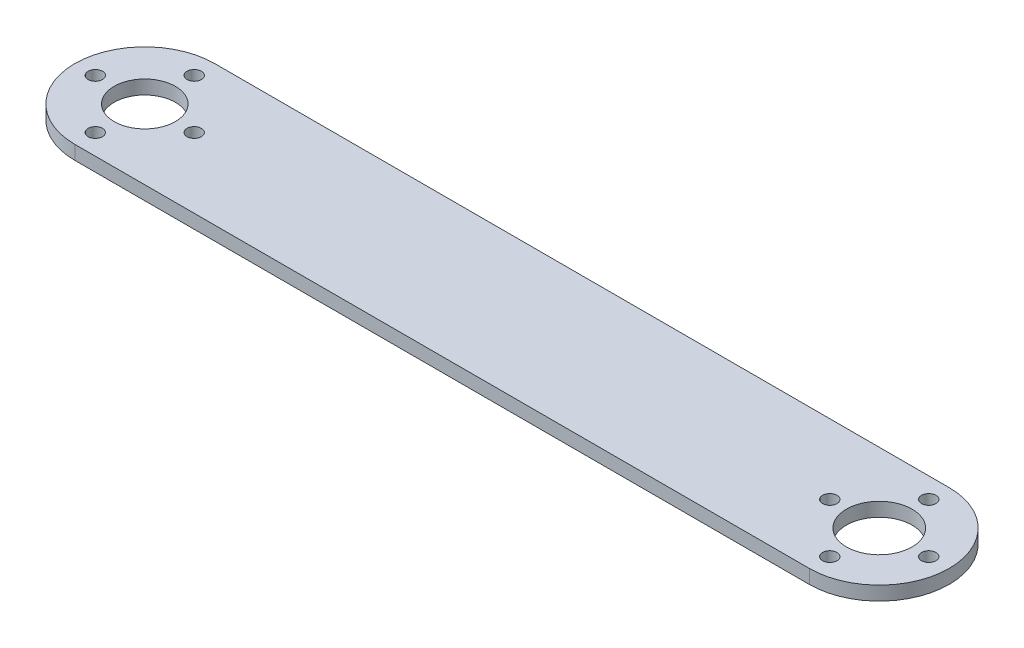
ISO-10303-21;
HEADER;
FILE_DESCRIPTION(('STEP AP214'),'2;1');
FILE_NAME('part.step','',(''),(''),'','','');
FILE_SCHEMA(('AUTOMOTIVE_DESIGN { 1 0 10303 214 1 1 1 1 }'));
ENDSEC;
DATA;
#1=APPLICATION_CONTEXT('core data for automotive mechanical design processes');
#2=APPLICATION_PROTOCOL_DEFINITION('international standard','automotive_design',2000,#1);
#3=PRODUCT_CONTEXT('',#1,'mechanical');
#4=PRODUCT('Part','Part','',(#3));
#5=PRODUCT_RELATED_PRODUCT_CATEGORY('part','',(#4));
#6=PRODUCT_DEFINITION_FORMATION('','',#4);
#7=PRODUCT_DEFINITION_CONTEXT('part definition',#1,'design');
#8=PRODUCT_DEFINITION('design','',#6,#7);
#9=PRODUCT_DEFINITION_SHAPE('','',#8);
#10=(LENGTH_UNIT() NAMED_UNIT(*) SI_UNIT(.MILLI.,.METRE.));
#11=(NAMED_UNIT(*) PLANE_ANGLE_UNIT() SI_UNIT($,.RADIAN.));
#12=(NAMED_UNIT(*) SI_UNIT($,.STERADIAN.) SOLID_ANGLE_UNIT());
#13=UNCERTAINTY_MEASURE_WITH_UNIT(LENGTH_MEASURE(1.E-05),#10,'distance_accuracy_value','');
#14=(GEOMETRIC_REPRESENTATION_CONTEXT(3) GLOBAL_UNCERTAINTY_ASSIGNED_CONTEXT((#13)) GLOBAL_UNIT_ASSIGNED_CONTEXT((#10,
#11,#12)) REPRESENTATION_CONTEXT('',''));
#15=CARTESIAN_POINT('',(0.,0.,0.));
#16=DIRECTION('',(0.,0.,1.));
#17=DIRECTION('',(1.,0.,0.));
#18=AXIS2_PLACEMENT_3D('',#15,#16,#17);
#19=CARTESIAN_POINT('',(0.,3.175,0.));
#20=DIRECTION('',(0.,1.,0.));
#21=DIRECTION('',(0.,0.,1.));
#22=AXIS2_PLACEMENT_3D('',#19,#20,#21);
#23=PLANE('',#22);
#24=CARTESIAN_POINT('',(168.,3.175,-27.3137084989848));
#25=DIRECTION('',(0.,1.,0.));
#26=DIRECTION('',(0.,0.,1.));
#27=AXIS2_PLACEMENT_3D('',#24,#25,#26);
#28=CIRCLE('',#27,1.65000000000002);
#29=CARTESIAN_POINT('',(168.,3.175,-25.6637084989848));
#30=VERTEX_POINT('',#29);
#31=EDGE_CURVE('E218',#30,#30,#28,.F.);
#32=ORIENTED_EDGE('',*,*,#31,.T.);
#33=EDGE_LOOP('',(#32));
#34=FACE_BOUND('',#33,.T.);
#35=CARTESIAN_POINT('',(168.,3.175,-4.68629150101526));
#36=DIRECTION('',(0.,-1.,0.));
#37=DIRECTION('',(0.,0.,-1.));
#38=AXIS2_PLACEMENT_3D('',#35,#36,#37);
#39=CIRCLE('',#38,1.65000000000002);
#40=CARTESIAN_POINT('',(168.,3.175,-6.33629150101528));
#41=VERTEX_POINT('',#40);
#42=EDGE_CURVE('E265',#41,#41,#39,.T.);
#43=ORIENTED_EDGE('',*,*,#42,.T.);
#44=EDGE_LOOP('',(#43));
#45=FACE_BOUND('',#44,.T.);
#46=CARTESIAN_POINT('',(179.313708498985,3.175,-16.));
#47=DIRECTION('',(0.,-1.,0.));
#48=DIRECTION('',(0.,0.,-1.));
#49=AXIS2_PLACEMENT_3D('',#46,#47,#48);
#50=CIRCLE('',#49,1.64999999999999);
#51=CARTESIAN_POINT('',(179.313708498985,3.175,-17.65));
#52=VERTEX_POINT('',#51);
#53=EDGE_CURVE('E268',#52,#52,#50,.T.);
#54=ORIENTED_EDGE('',*,*,#53,.T.);
#55=EDGE_LOOP('',(#54));
#56=FACE_BOUND('',#55,.T.);
#57=CARTESIAN_POINT('',(156.686291501015,3.175,-16.));
#58=DIRECTION('',(0.,1.,0.));
#59=DIRECTION('',(0.,0.,1.));
#60=AXIS2_PLACEMENT_3D('',#57,#58,#59);
#61=CIRCLE('',#60,1.64999999999999);
#62=CARTESIAN_POINT('',(156.686291501015,3.175,-14.35));
#63=VERTEX_POINT('',#62);
#64=EDGE_CURVE('E127',#63,#63,#61,.F.);
#65=ORIENTED_EDGE('',*,*,#64,.T.);
#66=EDGE_LOOP('',(#65));
#67=FACE_BOUND('',#66,.T.);
#68=CARTESIAN_POINT('',(168.,3.175,-16.));
#69=DIRECTION('',(0.,1.,0.));
#70=DIRECTION('',(0.,0.,1.));
#71=AXIS2_PLACEMENT_3D('',#68,#69,#70);
#72=CIRCLE('',#71,16.);
#73=CARTESIAN_POINT('',(168.,3.175,-32.));
#74=VERTEX_POINT('',#73);
#75=CARTESIAN_POINT('',(168.,3.175,0.));
#76=VERTEX_POINT('',#75);
#77=EDGE_CURVE('E96',#74,#76,#72,.F.);
#78=ORIENTED_EDGE('',*,*,#77,.F.);
#79=DIRECTION('',(1.,0.,0.));
#80=VECTOR('',#79,1.);
#81=CARTESIAN_POINT('',(0.,3.175,-32.));
#82=LINE('',#81,#80);
#83=CARTESIAN_POINT('',(0.,3.175,-32.));
#84=VERTEX_POINT('',#83);
#85=EDGE_CURVE('E87',#84,#74,#82,.T.);
#86=ORIENTED_EDGE('',*,*,#85,.F.);
#87=CARTESIAN_POINT('',(0.,3.175,-16.));
#88=DIRECTION('',(0.,1.,0.));
#89=DIRECTION('',(0.,0.,1.));
#90=AXIS2_PLACEMENT_3D('',#87,#88,#89);
#91=CIRCLE('',#90,16.);
#92=CARTESIAN_POINT('',(0.,3.175,0.));
#93=VERTEX_POINT('',#92);
#94=EDGE_CURVE('E92',#84,#93,#91,.T.);
#95=ORIENTED_EDGE('',*,*,#94,.T.);
#96=DIRECTION('',(1.,0.,0.));
#97=VECTOR('',#96,1.);
#98=CARTESIAN_POINT('',(0.,3.175,0.));
#99=LINE('',#98,#97);
#100=EDGE_CURVE('E54',#93,#76,#99,.T.);
#101=ORIENTED_EDGE('',*,*,#100,.T.);
#102=EDGE_LOOP('',(#78,#86,#95,#101));
#103=FACE_BOUND('',#102,.T.);
#104=CARTESIAN_POINT('',(168.,3.175,-16.));
#105=DIRECTION('',(0.,1.,0.));
#106=DIRECTION('',(0.,0.,1.));
#107=AXIS2_PLACEMENT_3D('',#104,#105,#106);
#108=CIRCLE('',#107,7.50000000000001);
#109=CARTESIAN_POINT('',(168.,3.175,-8.49999999999999));
#110=VERTEX_POINT('',#109);
#111=EDGE_CURVE('E103',#110,#110,#108,.T.);
#112=ORIENTED_EDGE('',*,*,#111,.F.);
#113=EDGE_LOOP('',(#112));
#114=FACE_BOUND('',#113,.T.);
#115=CARTESIAN_POINT('',(0.,3.175,-16.));
#116=DIRECTION('',(0.,1.,0.));
#117=DIRECTION('',(0.,0.,1.));
#118=AXIS2_PLACEMENT_3D('',#115,#116,#117);
#119=CIRCLE('',#118,7.);
#120=CARTESIAN_POINT('',(0.,3.175,-9.));
#121=VERTEX_POINT('',#120);
#122=EDGE_CURVE('E106',#121,#121,#119,.T.);
#123=ORIENTED_EDGE('',*,*,#122,.F.);
#124=EDGE_LOOP('',(#123));
#125=FACE_BOUND('',#124,.T.);
#126=CARTESIAN_POINT('',(0.,3.175,-4.68629150101524));
#127=DIRECTION('',(0.,1.,0.));
#128=DIRECTION('',(0.,0.,1.));
#129=AXIS2_PLACEMENT_3D('',#126,#127,#128);
#130=CIRCLE('',#129,1.65);
#131=CARTESIAN_POINT('',(0.,3.175,-3.03629150101524));
#132=VERTEX_POINT('',#131);
#133=EDGE_CURVE('E256',#132,#132,#130,.T.);
#134=ORIENTED_EDGE('',*,*,#133,.F.);
#135=EDGE_LOOP('',(#134));
#136=FACE_BOUND('',#135,.T.);
#137=CARTESIAN_POINT('',(-11.3137084989848,3.175,-16.));
#138=DIRECTION('',(0.,1.,0.));
#139=DIRECTION('',(0.,0.,1.));
#140=AXIS2_PLACEMENT_3D('',#137,#138,#139);
#141=CIRCLE('',#140,1.65);
#142=CARTESIAN_POINT('',(-11.3137084989848,3.175,-14.35));
#143=VERTEX_POINT('',#142);
#144=EDGE_CURVE('E216',#143,#143,#141,.T.);
#145=ORIENTED_EDGE('',*,*,#144,.F.);
#146=EDGE_LOOP('',(#145));
#147=FACE_BOUND('',#146,.T.);
#148=CARTESIAN_POINT('',(0.,3.175,-27.3137084989848));
#149=DIRECTION('',(0.,1.,0.));
#150=DIRECTION('',(0.,0.,1.));
#151=AXIS2_PLACEMENT_3D('',#148,#149,#150);
#152=CIRCLE('',#151,1.65);
#153=CARTESIAN_POINT('',(0.,3.175,-25.6637084989848));
#154=VERTEX_POINT('',#153);
#155=EDGE_CURVE('E219',#154,#154,#152,.T.);
#156=ORIENTED_EDGE('',*,*,#155,.F.);
#157=EDGE_LOOP('',(#156));
#158=FACE_BOUND('',#157,.T.);
#159=CARTESIAN_POINT('',(11.3137084989848,3.175,-16.));
#160=DIRECTION('',(0.,1.,0.));
#161=DIRECTION('',(0.,0.,1.));
#162=AXIS2_PLACEMENT_3D('',#159,#160,#161);
#163=CIRCLE('',#162,1.65);
#164=CARTESIAN_POINT('',(11.3137084989848,3.175,-14.35));
#165=VERTEX_POINT('',#164);
#166=EDGE_CURVE('E223',#165,#165,#163,.T.);
#167=ORIENTED_EDGE('',*,*,#166,.F.);
#168=EDGE_LOOP('',(#167));
#169=FACE_BOUND('',#168,.T.);
#170=ADVANCED_FACE('F35',(#34,#45,#56,#67,#103,#114,#125,#136,#147,#158,#169),#23,.T.);
#171=CARTESIAN_POINT('',(0.,0.,0.));
#172=DIRECTION('',(0.,1.,0.));
#173=DIRECTION('',(0.,0.,1.));
#174=AXIS2_PLACEMENT_3D('',#171,#172,#173);
#175=PLANE('',#174);
#176=CARTESIAN_POINT('',(0.,0.,-27.3137084989848));
#177=DIRECTION('',(0.,1.,0.));
#178=DIRECTION('',(0.,0.,1.));
#179=AXIS2_PLACEMENT_3D('',#176,#177,#178);
#180=CIRCLE('',#179,1.65);
#181=CARTESIAN_POINT('',(0.,0.,-25.6637084989848));
#182=VERTEX_POINT('',#181);
#183=EDGE_CURVE('E141',#182,#182,#180,.T.);
#184=ORIENTED_EDGE('',*,*,#183,.T.);
#185=EDGE_LOOP('',(#184));
#186=FACE_BOUND('',#185,.T.);
#187=CARTESIAN_POINT('',(0.,0.,-4.68629150101524));
#188=DIRECTION('',(0.,1.,0.));
#189=DIRECTION('',(0.,0.,1.));
#190=AXIS2_PLACEMENT_3D('',#187,#188,#189);
#191=CIRCLE('',#190,1.65);
#192=CARTESIAN_POINT('',(0.,0.,-3.03629150101524));
#193=VERTEX_POINT('',#192);
#194=EDGE_CURVE('E133',#193,#193,#191,.T.);
#195=ORIENTED_EDGE('',*,*,#194,.T.);
#196=EDGE_LOOP('',(#195));
#197=FACE_BOUND('',#196,.T.);
#198=CARTESIAN_POINT('',(168.,0.,-4.68629150101526));
#199=DIRECTION('',(0.,1.,0.));
#200=DIRECTION('',(0.,0.,1.));
#201=AXIS2_PLACEMENT_3D('',#198,#199,#200);
#202=CIRCLE('',#201,1.65000000000002);
#203=CARTESIAN_POINT('',(168.,0.,-3.03629150101524));
#204=VERTEX_POINT('',#203);
#205=EDGE_CURVE('E130',#204,#204,#202,.F.);
#206=ORIENTED_EDGE('',*,*,#205,.F.);
#207=EDGE_LOOP('',(#206));
#208=FACE_BOUND('',#207,.T.);
#209=CARTESIAN_POINT('',(179.313708498985,0.,-16.));
#210=DIRECTION('',(0.,1.,0.));
#211=DIRECTION('',(0.,0.,1.));
#212=AXIS2_PLACEMENT_3D('',#209,#210,#211);
#213=CIRCLE('',#212,1.64999999999999);
#214=CARTESIAN_POINT('',(179.313708498985,0.,-14.35));
#215=VERTEX_POINT('',#214);
#216=EDGE_CURVE('E126',#215,#215,#213,.F.);
#217=ORIENTED_EDGE('',*,*,#216,.F.);
#218=EDGE_LOOP('',(#217));
#219=FACE_BOUND('',#218,.T.);
#220=CARTESIAN_POINT('',(156.686291501015,0.,-16.));
#221=DIRECTION('',(0.,1.,0.));
#222=DIRECTION('',(0.,0.,1.));
#223=AXIS2_PLACEMENT_3D('',#220,#221,#222);
#224=CIRCLE('',#223,1.64999999999999);
#225=CARTESIAN_POINT('',(156.686291501015,0.,-14.35));
#226=VERTEX_POINT('',#225);
#227=EDGE_CURVE('E123',#226,#226,#224,.F.);
#228=ORIENTED_EDGE('',*,*,#227,.F.);
#229=EDGE_LOOP('',(#228));
#230=FACE_BOUND('',#229,.T.);
#231=CARTESIAN_POINT('',(168.,0.,-16.));
#232=DIRECTION('',(0.,1.,0.));
#233=DIRECTION('',(0.,0.,1.));
#234=AXIS2_PLACEMENT_3D('',#231,#232,#233);
#235=CIRCLE('',#234,16.);
#236=CARTESIAN_POINT('',(168.,0.,-32.));
#237=VERTEX_POINT('',#236);
#238=CARTESIAN_POINT('',(168.,0.,0.));
#239=VERTEX_POINT('',#238);
#240=EDGE_CURVE('E109',#237,#239,#235,.F.);
#241=ORIENTED_EDGE('',*,*,#240,.T.);
#242=DIRECTION('',(1.,0.,0.));
#243=VECTOR('',#242,1.);
#244=CARTESIAN_POINT('',(0.,0.,0.));
#245=LINE('',#244,#243);
#246=CARTESIAN_POINT('',(0.,0.,0.));
#247=VERTEX_POINT('',#246);
#248=EDGE_CURVE('E114',#247,#239,#245,.T.);
#249=ORIENTED_EDGE('',*,*,#248,.F.);
#250=CARTESIAN_POINT('',(0.,0.,-16.));
#251=DIRECTION('',(0.,1.,0.));
#252=DIRECTION('',(0.,0.,1.));
#253=AXIS2_PLACEMENT_3D('',#250,#251,#252);
#254=CIRCLE('',#253,16.);
#255=CARTESIAN_POINT('',(0.,0.,-32.));
#256=VERTEX_POINT('',#255);
#257=EDGE_CURVE('E69',#256,#247,#254,.T.);
#258=ORIENTED_EDGE('',*,*,#257,.F.);
#259=DIRECTION('',(1.,0.,0.));
#260=VECTOR('',#259,1.);
#261=CARTESIAN_POINT('',(0.,0.,-32.));
#262=LINE('',#261,#260);
#263=EDGE_CURVE('E89',#256,#237,#262,.T.);
#264=ORIENTED_EDGE('',*,*,#263,.T.);
#265=EDGE_LOOP('',(#241,#249,#258,#264));
#266=FACE_BOUND('',#265,.T.);
#267=CARTESIAN_POINT('',(168.,0.,-16.));
#268=DIRECTION('',(0.,1.,0.));
#269=DIRECTION('',(0.,0.,1.));
#270=AXIS2_PLACEMENT_3D('',#267,#268,#269);
#271=CIRCLE('',#270,7.50000000000001);
#272=CARTESIAN_POINT('',(168.,0.,-8.49999999999999));
#273=VERTEX_POINT('',#272);
#274=EDGE_CURVE('E116',#273,#273,#271,.T.);
#275=ORIENTED_EDGE('',*,*,#274,.T.);
#276=EDGE_LOOP('',(#275));
#277=FACE_BOUND('',#276,.T.);
#278=CARTESIAN_POINT('',(0.,0.,-16.));
#279=DIRECTION('',(0.,1.,0.));
#280=DIRECTION('',(0.,0.,1.));
#281=AXIS2_PLACEMENT_3D('',#278,#279,#280);
#282=CIRCLE('',#281,7.);
#283=CARTESIAN_POINT('',(0.,0.,-9.));
#284=VERTEX_POINT('',#283);
#285=EDGE_CURVE('E98',#284,#284,#282,.T.);
#286=ORIENTED_EDGE('',*,*,#285,.T.);
#287=EDGE_LOOP('',(#286));
#288=FACE_BOUND('',#287,.T.);
#289=CARTESIAN_POINT('',(168.,0.,-27.3137084989848));
#290=DIRECTION('',(0.,1.,0.));
#291=DIRECTION('',(0.,0.,1.));
#292=AXIS2_PLACEMENT_3D('',#289,#290,#291);
#293=CIRCLE('',#292,1.65000000000002);
#294=CARTESIAN_POINT('',(168.,0.,-25.6637084989848));
#295=VERTEX_POINT('',#294);
#296=EDGE_CURVE('E136',#295,#295,#293,.F.);
#297=ORIENTED_EDGE('',*,*,#296,.F.);
#298=EDGE_LOOP('',(#297));
#299=FACE_BOUND('',#298,.T.);
#300=CARTESIAN_POINT('',(-11.3137084989848,0.,-16.));
#301=DIRECTION('',(0.,1.,0.));
#302=DIRECTION('',(0.,0.,1.));
#303=AXIS2_PLACEMENT_3D('',#300,#301,#302);
#304=CIRCLE('',#303,1.65);
#305=CARTESIAN_POINT('',(-11.3137084989848,0.,-14.35));
#306=VERTEX_POINT('',#305);
#307=EDGE_CURVE('E139',#306,#306,#304,.T.);
#308=ORIENTED_EDGE('',*,*,#307,.T.);
#309=EDGE_LOOP('',(#308));
#310=FACE_BOUND('',#309,.T.);
#311=CARTESIAN_POINT('',(11.3137084989848,0.,-16.));
#312=DIRECTION('',(0.,1.,0.));
#313=DIRECTION('',(0.,0.,1.));
#314=AXIS2_PLACEMENT_3D('',#311,#312,#313);
#315=CIRCLE('',#314,1.65);
#316=CARTESIAN_POINT('',(11.3137084989848,0.,-14.35));
#317=VERTEX_POINT('',#316);
#318=EDGE_CURVE('E39',#317,#317,#315,.T.);
#319=ORIENTED_EDGE('',*,*,#318,.T.);
#320=EDGE_LOOP('',(#319));
#321=FACE_BOUND('',#320,.T.);
#322=ADVANCED_FACE('F148',(#186,#197,#208,#219,#230,#266,#277,#288,#299,#310,#321),#175,.F.);
#323=CARTESIAN_POINT('',(168.,3.175,-16.));
#324=DIRECTION('',(0.,-1.,0.));
#325=DIRECTION('',(0.,0.,-1.));
#326=AXIS2_PLACEMENT_3D('',#323,#324,#325);
#327=CYLINDRICAL_SURFACE('',#326,16.);
#328=ORIENTED_EDGE('',*,*,#240,.F.);
#329=DIRECTION('',(0.,-1.,0.));
#330=VECTOR('',#329,1.);
#331=CARTESIAN_POINT('',(168.,3.175,-32.));
#332=LINE('',#331,#330);
#333=EDGE_CURVE('E11',#74,#237,#332,.T.);
#334=ORIENTED_EDGE('',*,*,#333,.F.);
#335=ORIENTED_EDGE('',*,*,#77,.T.);
#336=DIRECTION('',(0.,-1.,0.));
#337=VECTOR('',#336,1.);
#338=CARTESIAN_POINT('',(168.,3.175,0.));
#339=LINE('',#338,#337);
#340=EDGE_CURVE('E76',#76,#239,#339,.T.);
#341=ORIENTED_EDGE('',*,*,#340,.T.);
#342=EDGE_LOOP('',(#328,#334,#335,#341));
#343=FACE_BOUND('',#342,.T.);
#344=ADVANCED_FACE('F37',(#343),#327,.T.);
#345=CARTESIAN_POINT('',(0.,3.175,-32.));
#346=DIRECTION('',(0.,0.,-1.));
#347=DIRECTION('',(-1.,0.,0.));
#348=AXIS2_PLACEMENT_3D('',#345,#346,#347);
#349=PLANE('',#348);
#350=ORIENTED_EDGE('',*,*,#263,.F.);
#351=DIRECTION('',(0.,-1.,0.));
#352=VECTOR('',#351,1.);
#353=CARTESIAN_POINT('',(0.,3.175,-32.));
#354=LINE('',#353,#352);
#355=EDGE_CURVE('E45',#84,#256,#354,.T.);
#356=ORIENTED_EDGE('',*,*,#355,.F.);
#357=ORIENTED_EDGE('',*,*,#85,.T.);
#358=ORIENTED_EDGE('',*,*,#333,.T.);
#359=EDGE_LOOP('',(#350,#356,#357,#358));
#360=FACE_BOUND('',#359,.T.);
#361=ADVANCED_FACE('F85',(#360),#349,.T.);
#362=CARTESIAN_POINT('',(0.,3.175,-16.));
#363=DIRECTION('',(0.,-1.,0.));
#364=DIRECTION('',(0.,0.,-1.));
#365=AXIS2_PLACEMENT_3D('',#362,#363,#364);
#366=CYLINDRICAL_SURFACE('',#365,16.);
#367=ORIENTED_EDGE('',*,*,#257,.T.);
#368=DIRECTION('',(0.,-1.,0.));
#369=VECTOR('',#368,1.);
#370=CARTESIAN_POINT('',(0.,3.175,0.));
#371=LINE('',#370,#369);
#372=EDGE_CURVE('E90',#93,#247,#371,.T.);
#373=ORIENTED_EDGE('',*,*,#372,.F.);
#374=ORIENTED_EDGE('',*,*,#94,.F.);
#375=ORIENTED_EDGE('',*,*,#355,.T.);
#376=EDGE_LOOP('',(#367,#373,#374,#375));
#377=FACE_BOUND('',#376,.T.);
#378=ADVANCED_FACE('F93',(#377),#366,.T.);
#379=CARTESIAN_POINT('',(168.,3.175,-16.));
#380=DIRECTION('',(0.,-1.,0.));
#381=DIRECTION('',(0.,0.,-1.));
#382=AXIS2_PLACEMENT_3D('',#379,#380,#381);
#383=CYLINDRICAL_SURFACE('',#382,7.50000000000001);
#384=ORIENTED_EDGE('',*,*,#111,.T.);
#385=EDGE_LOOP('',(#384));
#386=FACE_BOUND('',#385,.T.);
#387=ORIENTED_EDGE('',*,*,#274,.F.);
#388=EDGE_LOOP('',(#387));
#389=FACE_BOUND('',#388,.T.);
#390=ADVANCED_FACE('F181',(#386,#389),#383,.F.);
#391=CARTESIAN_POINT('',(0.,3.175,0.));
#392=DIRECTION('',(0.,0.,-1.));
#393=DIRECTION('',(-1.,0.,0.));
#394=AXIS2_PLACEMENT_3D('',#391,#392,#393);
#395=PLANE('',#394);
#396=ORIENTED_EDGE('',*,*,#248,.T.);
#397=ORIENTED_EDGE('',*,*,#340,.F.);
#398=ORIENTED_EDGE('',*,*,#100,.F.);
#399=ORIENTED_EDGE('',*,*,#372,.T.);
#400=EDGE_LOOP('',(#396,#397,#398,#399));
#401=FACE_BOUND('',#400,.T.);
#402=ADVANCED_FACE('F179',(#401),#395,.F.);
#403=CARTESIAN_POINT('',(0.,3.175,-16.));
#404=DIRECTION('',(0.,-1.,0.));
#405=DIRECTION('',(0.,0.,-1.));
#406=AXIS2_PLACEMENT_3D('',#403,#404,#405);
#407=CYLINDRICAL_SURFACE('',#406,7.);
#408=ORIENTED_EDGE('',*,*,#122,.T.);
#409=EDGE_LOOP('',(#408));
#410=FACE_BOUND('',#409,.T.);
#411=ORIENTED_EDGE('',*,*,#285,.F.);
#412=EDGE_LOOP('',(#411));
#413=FACE_BOUND('',#412,.T.);
#414=ADVANCED_FACE('F176',(#410,#413),#407,.F.);
#415=CARTESIAN_POINT('',(156.686291501015,-6.825,-16.));
#416=DIRECTION('',(0.,1.,0.));
#417=DIRECTION('',(0.,0.,1.));
#418=AXIS2_PLACEMENT_3D('',#415,#416,#417);
#419=CYLINDRICAL_SURFACE('',#418,1.64999999999999);
#420=ORIENTED_EDGE('',*,*,#64,.F.);
#421=EDGE_LOOP('',(#420));
#422=FACE_BOUND('',#421,.T.);
#423=ORIENTED_EDGE('',*,*,#227,.T.);
#424=EDGE_LOOP('',(#423));
#425=FACE_BOUND('',#424,.T.);
#426=ADVANCED_FACE('F173',(#422,#425),#419,.F.);
#427=CARTESIAN_POINT('',(179.313708498985,-6.825,-16.));
#428=DIRECTION('',(0.,1.,0.));
#429=DIRECTION('',(0.,0.,1.));
#430=AXIS2_PLACEMENT_3D('',#427,#428,#429);
#431=CYLINDRICAL_SURFACE('',#430,1.64999999999999);
#432=ORIENTED_EDGE('',*,*,#53,.F.);
#433=EDGE_LOOP('',(#432));
#434=FACE_BOUND('',#433,.T.);
#435=ORIENTED_EDGE('',*,*,#216,.T.);
#436=EDGE_LOOP('',(#435));
#437=FACE_BOUND('',#436,.T.);
#438=ADVANCED_FACE('F232',(#434,#437),#431,.F.);
#439=CARTESIAN_POINT('',(168.,-6.825,-4.68629150101526));
#440=DIRECTION('',(0.,1.,0.));
#441=DIRECTION('',(0.,0.,1.));
#442=AXIS2_PLACEMENT_3D('',#439,#440,#441);
#443=CYLINDRICAL_SURFACE('',#442,1.65000000000002);
#444=ORIENTED_EDGE('',*,*,#42,.F.);
#445=EDGE_LOOP('',(#444));
#446=FACE_BOUND('',#445,.T.);
#447=ORIENTED_EDGE('',*,*,#205,.T.);
#448=EDGE_LOOP('',(#447));
#449=FACE_BOUND('',#448,.T.);
#450=ADVANCED_FACE('F238',(#446,#449),#443,.F.);
#451=CARTESIAN_POINT('',(0.,-6.825,-4.68629150101524));
#452=DIRECTION('',(0.,1.,0.));
#453=DIRECTION('',(0.,0.,1.));
#454=AXIS2_PLACEMENT_3D('',#451,#452,#453);
#455=CYLINDRICAL_SURFACE('',#454,1.65);
#456=ORIENTED_EDGE('',*,*,#133,.T.);
#457=EDGE_LOOP('',(#456));
#458=FACE_BOUND('',#457,.T.);
#459=ORIENTED_EDGE('',*,*,#194,.F.);
#460=EDGE_LOOP('',(#459));
#461=FACE_BOUND('',#460,.T.);
#462=ADVANCED_FACE('F212',(#458,#461),#455,.F.);
#463=CARTESIAN_POINT('',(168.,-6.825,-27.3137084989848));
#464=DIRECTION('',(0.,1.,0.));
#465=DIRECTION('',(0.,0.,1.));
#466=AXIS2_PLACEMENT_3D('',#463,#464,#465);
#467=CYLINDRICAL_SURFACE('',#466,1.65000000000002);
#468=ORIENTED_EDGE('',*,*,#31,.F.);
#469=EDGE_LOOP('',(#468));
#470=FACE_BOUND('',#469,.T.);
#471=ORIENTED_EDGE('',*,*,#296,.T.);
#472=EDGE_LOOP('',(#471));
#473=FACE_BOUND('',#472,.T.);
#474=ADVANCED_FACE('F207',(#470,#473),#467,.F.);
#475=CARTESIAN_POINT('',(-11.3137084989848,-6.825,-16.));
#476=DIRECTION('',(0.,1.,0.));
#477=DIRECTION('',(0.,0.,1.));
#478=AXIS2_PLACEMENT_3D('',#475,#476,#477);
#479=CYLINDRICAL_SURFACE('',#478,1.65);
#480=ORIENTED_EDGE('',*,*,#144,.T.);
#481=EDGE_LOOP('',(#480));
#482=FACE_BOUND('',#481,.T.);
#483=ORIENTED_EDGE('',*,*,#307,.F.);
#484=EDGE_LOOP('',(#483));
#485=FACE_BOUND('',#484,.T.);
#486=ADVANCED_FACE('F158',(#482,#485),#479,.F.);
#487=CARTESIAN_POINT('',(0.,-6.825,-27.3137084989848));
#488=DIRECTION('',(0.,1.,0.));
#489=DIRECTION('',(0.,0.,1.));
#490=AXIS2_PLACEMENT_3D('',#487,#488,#489);
#491=CYLINDRICAL_SURFACE('',#490,1.65);
#492=ORIENTED_EDGE('',*,*,#155,.T.);
#493=EDGE_LOOP('',(#492));
#494=FACE_BOUND('',#493,.T.);
#495=ORIENTED_EDGE('',*,*,#183,.F.);
#496=EDGE_LOOP('',(#495));
#497=FACE_BOUND('',#496,.T.);
#498=ADVANCED_FACE('F152',(#494,#497),#491,.F.);
#499=CARTESIAN_POINT('',(11.3137084989848,-6.825,-16.));
#500=DIRECTION('',(0.,1.,0.));
#501=DIRECTION('',(0.,0.,1.));
#502=AXIS2_PLACEMENT_3D('',#499,#500,#501);
#503=CYLINDRICAL_SURFACE('',#502,1.65);
#504=ORIENTED_EDGE('',*,*,#166,.T.);
#505=EDGE_LOOP('',(#504));
#506=FACE_BOUND('',#505,.T.);
#507=ORIENTED_EDGE('',*,*,#318,.F.);
#508=EDGE_LOOP('',(#507));
#509=FACE_BOUND('',#508,.T.);
#510=ADVANCED_FACE('F150',(#506,#509),#503,.F.);
#511=CLOSED_SHELL('',(#170,#322,#344,#361,#378,#390,#402,#414,#426,#438,#450,#462,#474,#486,
#498,#510));
#512=MANIFOLD_SOLID_BREP('B2',#511);
#513=ADVANCED_BREP_SHAPE_REPRESENTATION('',(#18,#512),#14);
#514=SHAPE_DEFINITION_REPRESENTATION(#9,#513);
ENDSEC;
END-ISO-10303-21;
